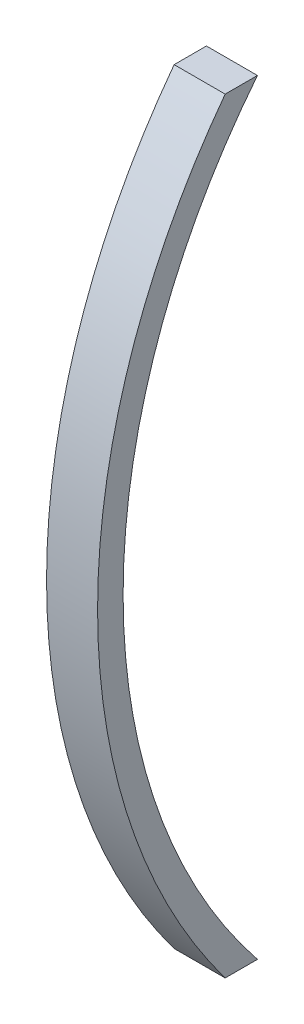
ISO-10303-21;
HEADER;
FILE_DESCRIPTION(('STEP AP214'),'2;1');
FILE_NAME('part.step','',(''),(''),'','','');
FILE_SCHEMA(('AUTOMOTIVE_DESIGN { 1 0 10303 214 1 1 1 1 }'));
ENDSEC;
DATA;
#1=APPLICATION_CONTEXT('core data for automotive mechanical design processes');
#2=APPLICATION_PROTOCOL_DEFINITION('international standard','automotive_design',2000,#1);
#3=PRODUCT_CONTEXT('',#1,'mechanical');
#4=PRODUCT('Part','Part','',(#3));
#5=PRODUCT_RELATED_PRODUCT_CATEGORY('part','',(#4));
#6=PRODUCT_DEFINITION_FORMATION('','',#4);
#7=PRODUCT_DEFINITION_CONTEXT('part definition',#1,'design');
#8=PRODUCT_DEFINITION('design','',#6,#7);
#9=PRODUCT_DEFINITION_SHAPE('','',#8);
#10=(LENGTH_UNIT() NAMED_UNIT(*) SI_UNIT(.MILLI.,.METRE.));
#11=(NAMED_UNIT(*) PLANE_ANGLE_UNIT() SI_UNIT($,.RADIAN.));
#12=(NAMED_UNIT(*) SI_UNIT($,.STERADIAN.) SOLID_ANGLE_UNIT());
#13=UNCERTAINTY_MEASURE_WITH_UNIT(LENGTH_MEASURE(1.E-05),#10,'distance_accuracy_value','');
#14=(GEOMETRIC_REPRESENTATION_CONTEXT(3) GLOBAL_UNCERTAINTY_ASSIGNED_CONTEXT((#13)) GLOBAL_UNIT_ASSIGNED_CONTEXT((#10,
#11,#12)) REPRESENTATION_CONTEXT('',''));
#15=CARTESIAN_POINT('',(0.,0.,0.));
#16=DIRECTION('',(0.,0.,1.));
#17=DIRECTION('',(1.,0.,0.));
#18=AXIS2_PLACEMENT_3D('',#15,#16,#17);
#19=CARTESIAN_POINT('',(10.,0.,-1.04083408558608E-13));
#20=DIRECTION('',(-1.,0.,0.));
#21=DIRECTION('',(0.,0.,1.));
#22=AXIS2_PLACEMENT_3D('',#19,#20,#21);
#23=CYLINDRICAL_SURFACE('',#22,125.);
#24=CARTESIAN_POINT('',(0.,0.,-1.04083408558608E-13));
#25=DIRECTION('',(1.,0.,0.));
#26=DIRECTION('',(0.,0.,-1.));
#27=AXIS2_PLACEMENT_3D('',#24,#25,#26);
#28=CIRCLE('',#27,125.);
#29=CARTESIAN_POINT('',(0.,75.,100.));
#30=VERTEX_POINT('',#29);
#31=CARTESIAN_POINT('',(0.,-75.,100.));
#32=VERTEX_POINT('',#31);
#33=EDGE_CURVE('E113',#30,#32,#28,.T.);
#34=ORIENTED_EDGE('',*,*,#33,.T.);
#35=DIRECTION('',(-1.,0.,0.));
#36=VECTOR('',#35,1.);
#37=CARTESIAN_POINT('',(10.,-75.,100.));
#38=LINE('',#37,#36);
#39=CARTESIAN_POINT('',(10.,-75.,100.));
#40=VERTEX_POINT('',#39);
#41=EDGE_CURVE('E11',#40,#32,#38,.T.);
#42=ORIENTED_EDGE('',*,*,#41,.F.);
#43=CARTESIAN_POINT('',(10.,0.,-1.04083408558608E-13));
#44=DIRECTION('',(1.,0.,0.));
#45=DIRECTION('',(0.,0.,-1.));
#46=AXIS2_PLACEMENT_3D('',#43,#44,#45);
#47=CIRCLE('',#46,125.);
#48=CARTESIAN_POINT('',(10.,75.,100.));
#49=VERTEX_POINT('',#48);
#50=EDGE_CURVE('E97',#49,#40,#47,.T.);
#51=ORIENTED_EDGE('',*,*,#50,.F.);
#52=DIRECTION('',(-1.,0.,0.));
#53=VECTOR('',#52,1.);
#54=CARTESIAN_POINT('',(10.,75.,100.));
#55=LINE('',#54,#53);
#56=EDGE_CURVE('E109',#49,#30,#55,.T.);
#57=ORIENTED_EDGE('',*,*,#56,.T.);
#58=EDGE_LOOP('',(#34,#42,#51,#57));
#59=FACE_BOUND('',#58,.T.);
#60=ADVANCED_FACE('F45',(#59),#23,.T.);
#61=CARTESIAN_POINT('',(10.,-75.,100.));
#62=DIRECTION('',(0.,1.,0.));
#63=DIRECTION('',(0.,0.,1.));
#64=AXIS2_PLACEMENT_3D('',#61,#62,#63);
#65=PLANE('',#64);
#66=DIRECTION('',(0.,0.,-1.));
#67=VECTOR('',#66,1.);
#68=CARTESIAN_POINT('',(0.,-75.,100.));
#69=LINE('',#68,#67);
#70=CARTESIAN_POINT('',(0.,-75.,93.674969975976));
#71=VERTEX_POINT('',#70);
#72=EDGE_CURVE('E102',#32,#71,#69,.T.);
#73=ORIENTED_EDGE('',*,*,#72,.T.);
#74=DIRECTION('',(-1.,0.,0.));
#75=VECTOR('',#74,1.);
#76=CARTESIAN_POINT('',(10.,-75.,93.674969975976));
#77=LINE('',#76,#75);
#78=CARTESIAN_POINT('',(10.,-75.,93.674969975976));
#79=VERTEX_POINT('',#78);
#80=EDGE_CURVE('E54',#79,#71,#77,.T.);
#81=ORIENTED_EDGE('',*,*,#80,.F.);
#82=DIRECTION('',(0.,0.,-1.));
#83=VECTOR('',#82,1.);
#84=CARTESIAN_POINT('',(10.,-75.,100.));
#85=LINE('',#84,#83);
#86=EDGE_CURVE('E92',#40,#79,#85,.T.);
#87=ORIENTED_EDGE('',*,*,#86,.F.);
#88=ORIENTED_EDGE('',*,*,#41,.T.);
#89=EDGE_LOOP('',(#73,#81,#87,#88));
#90=FACE_BOUND('',#89,.T.);
#91=ADVANCED_FACE('F101',(#90),#65,.F.);
#92=CARTESIAN_POINT('',(10.,0.,0.));
#93=DIRECTION('',(-1.,0.,0.));
#94=DIRECTION('',(0.,0.,1.));
#95=AXIS2_PLACEMENT_3D('',#92,#93,#94);
#96=CYLINDRICAL_SURFACE('',#95,120.);
#97=CARTESIAN_POINT('',(0.,0.,0.));
#98=DIRECTION('',(-1.,0.,0.));
#99=DIRECTION('',(0.,0.,-1.));
#100=AXIS2_PLACEMENT_3D('',#97,#98,#99);
#101=CIRCLE('',#100,120.);
#102=CARTESIAN_POINT('',(0.,75.,93.674969975976));
#103=VERTEX_POINT('',#102);
#104=EDGE_CURVE('E79',#71,#103,#101,.T.);
#105=ORIENTED_EDGE('',*,*,#104,.T.);
#106=DIRECTION('',(-1.,0.,0.));
#107=VECTOR('',#106,1.);
#108=CARTESIAN_POINT('',(10.,75.,93.674969975976));
#109=LINE('',#108,#107);
#110=CARTESIAN_POINT('',(10.,75.,93.674969975976));
#111=VERTEX_POINT('',#110);
#112=EDGE_CURVE('E104',#111,#103,#109,.T.);
#113=ORIENTED_EDGE('',*,*,#112,.F.);
#114=CARTESIAN_POINT('',(10.,0.,0.));
#115=DIRECTION('',(-1.,0.,0.));
#116=DIRECTION('',(0.,0.,-1.));
#117=AXIS2_PLACEMENT_3D('',#114,#115,#116);
#118=CIRCLE('',#117,120.);
#119=EDGE_CURVE('E95',#79,#111,#118,.T.);
#120=ORIENTED_EDGE('',*,*,#119,.F.);
#121=ORIENTED_EDGE('',*,*,#80,.T.);
#122=EDGE_LOOP('',(#105,#113,#120,#121));
#123=FACE_BOUND('',#122,.T.);
#124=ADVANCED_FACE('F105',(#123),#96,.F.);
#125=CARTESIAN_POINT('',(10.,75.,100.));
#126=DIRECTION('',(0.,-1.,0.));
#127=DIRECTION('',(0.,0.,-1.));
#128=AXIS2_PLACEMENT_3D('',#125,#126,#127);
#129=PLANE('',#128);
#130=DIRECTION('',(0.,0.,1.));
#131=VECTOR('',#130,1.);
#132=CARTESIAN_POINT('',(0.,75.,100.));
#133=LINE('',#132,#131);
#134=EDGE_CURVE('E85',#103,#30,#133,.T.);
#135=ORIENTED_EDGE('',*,*,#134,.T.);
#136=ORIENTED_EDGE('',*,*,#56,.F.);
#137=DIRECTION('',(0.,0.,1.));
#138=VECTOR('',#137,1.);
#139=CARTESIAN_POINT('',(10.,75.,100.));
#140=LINE('',#139,#138);
#141=EDGE_CURVE('E62',#111,#49,#140,.T.);
#142=ORIENTED_EDGE('',*,*,#141,.F.);
#143=ORIENTED_EDGE('',*,*,#112,.T.);
#144=EDGE_LOOP('',(#135,#136,#142,#143));
#145=FACE_BOUND('',#144,.T.);
#146=ADVANCED_FACE('F126',(#145),#129,.F.);
#147=CARTESIAN_POINT('',(10.,0.,-1.04083408558608E-13));
#148=DIRECTION('',(1.,0.,0.));
#149=DIRECTION('',(0.,0.,-1.));
#150=AXIS2_PLACEMENT_3D('',#147,#148,#149);
#151=PLANE('',#150);
#152=ORIENTED_EDGE('',*,*,#50,.T.);
#153=ORIENTED_EDGE('',*,*,#86,.T.);
#154=ORIENTED_EDGE('',*,*,#119,.T.);
#155=ORIENTED_EDGE('',*,*,#141,.T.);
#156=EDGE_LOOP('',(#152,#153,#154,#155));
#157=FACE_BOUND('',#156,.T.);
#158=ADVANCED_FACE('F93',(#157),#151,.T.);
#159=CARTESIAN_POINT('',(0.,0.,-1.04083408558608E-13));
#160=DIRECTION('',(1.,0.,0.));
#161=DIRECTION('',(0.,0.,-1.));
#162=AXIS2_PLACEMENT_3D('',#159,#160,#161);
#163=PLANE('',#162);
#164=ORIENTED_EDGE('',*,*,#33,.F.);
#165=ORIENTED_EDGE('',*,*,#134,.F.);
#166=ORIENTED_EDGE('',*,*,#104,.F.);
#167=ORIENTED_EDGE('',*,*,#72,.F.);
#168=EDGE_LOOP('',(#164,#165,#166,#167));
#169=FACE_BOUND('',#168,.T.);
#170=ADVANCED_FACE('F129',(#169),#163,.F.);
#171=CLOSED_SHELL('',(#60,#91,#124,#146,#158,#170));
#172=MANIFOLD_SOLID_BREP('B2',#171);
#173=ADVANCED_BREP_SHAPE_REPRESENTATION('',(#18,#172),#14);
#174=SHAPE_DEFINITION_REPRESENTATION(#9,#173);
ENDSEC;
END-ISO-10303-21;
